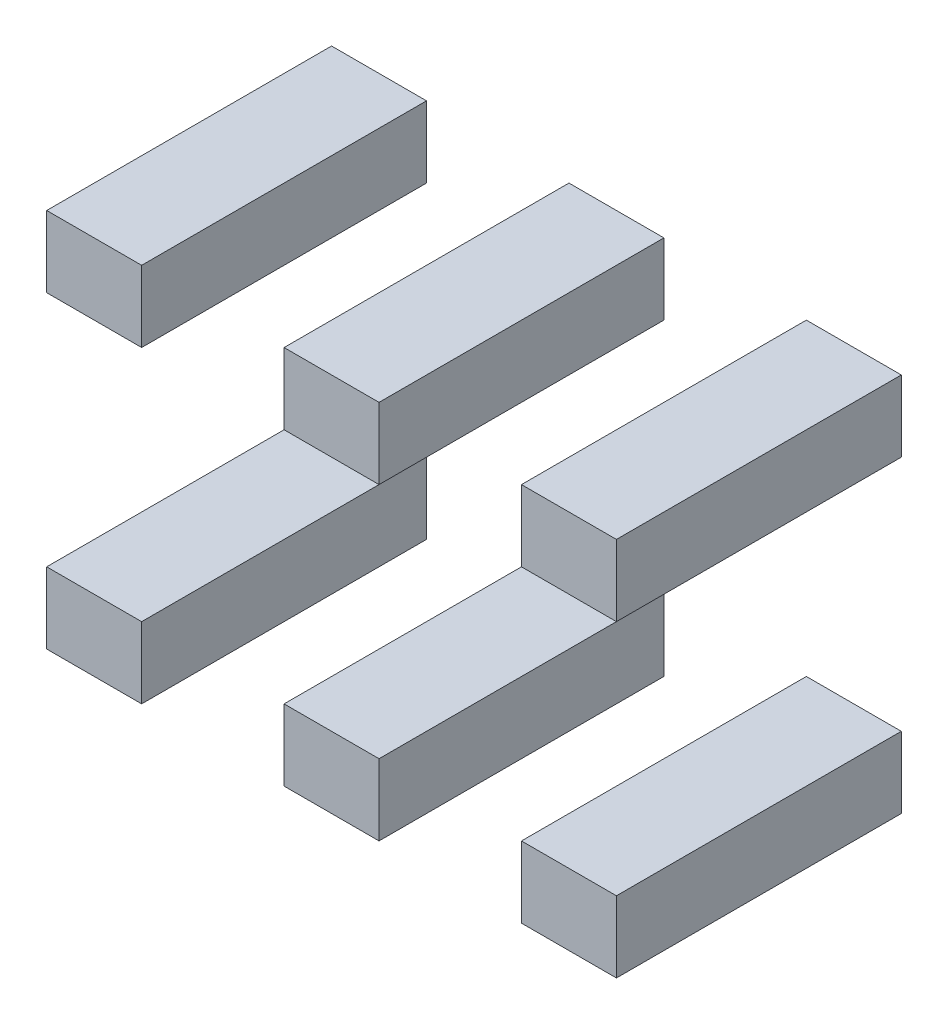
ISO-10303-21;
HEADER;
FILE_DESCRIPTION(('STEP AP214'),'2;1');
FILE_NAME('part.step','',(''),(''),'','','');
FILE_SCHEMA(('AUTOMOTIVE_DESIGN { 1 0 10303 214 1 1 1 1 }'));
ENDSEC;
DATA;
#1=APPLICATION_CONTEXT('core data for automotive mechanical design processes');
#2=APPLICATION_PROTOCOL_DEFINITION('international standard','automotive_design',2000,#1);
#3=PRODUCT_CONTEXT('',#1,'mechanical');
#4=PRODUCT('Part','Part','',(#3));
#5=PRODUCT_RELATED_PRODUCT_CATEGORY('part','',(#4));
#6=PRODUCT_DEFINITION_FORMATION('','',#4);
#7=PRODUCT_DEFINITION_CONTEXT('part definition',#1,'design');
#8=PRODUCT_DEFINITION('design','',#6,#7);
#9=PRODUCT_DEFINITION_SHAPE('','',#8);
#10=(LENGTH_UNIT() NAMED_UNIT(*) SI_UNIT(.MILLI.,.METRE.));
#11=(NAMED_UNIT(*) PLANE_ANGLE_UNIT() SI_UNIT($,.RADIAN.));
#12=(NAMED_UNIT(*) SI_UNIT($,.STERADIAN.) SOLID_ANGLE_UNIT());
#13=UNCERTAINTY_MEASURE_WITH_UNIT(LENGTH_MEASURE(1.E-05),#10,'distance_accuracy_value','');
#14=(GEOMETRIC_REPRESENTATION_CONTEXT(3) GLOBAL_UNCERTAINTY_ASSIGNED_CONTEXT((#13)) GLOBAL_UNIT_ASSIGNED_CONTEXT((#10,
#11,#12)) REPRESENTATION_CONTEXT('',''));
#15=CARTESIAN_POINT('',(0.,0.,0.));
#16=DIRECTION('',(0.,0.,1.));
#17=DIRECTION('',(1.,0.,0.));
#18=AXIS2_PLACEMENT_3D('',#15,#16,#17);
#19=CARTESIAN_POINT('',(0.6,-0.4,0.));
#20=DIRECTION('',(0.,-1.,0.));
#21=DIRECTION('',(0.,0.,-1.));
#22=AXIS2_PLACEMENT_3D('',#19,#20,#21);
#23=PLANE('',#22);
#24=DIRECTION('',(0.,0.,1.));
#25=VECTOR('',#24,1.);
#26=CARTESIAN_POINT('',(0.4,-0.4,0.));
#27=LINE('',#26,#25);
#28=CARTESIAN_POINT('',(0.4,-0.4,0.));
#29=VERTEX_POINT('',#28);
#30=CARTESIAN_POINT('',(0.4,-0.4,0.6));
#31=VERTEX_POINT('',#30);
#32=EDGE_CURVE('P0_E20',#29,#31,#27,.T.);
#33=ORIENTED_EDGE('',*,*,#32,.F.);
#34=DIRECTION('',(1.,0.,0.));
#35=VECTOR('',#34,1.);
#36=CARTESIAN_POINT('',(0.4,-0.4,0.));
#37=LINE('',#36,#35);
#38=CARTESIAN_POINT('',(0.6,-0.4,0.));
#39=VERTEX_POINT('',#38);
#40=EDGE_CURVE('P0_E80',#29,#39,#37,.T.);
#41=ORIENTED_EDGE('',*,*,#40,.T.);
#42=DIRECTION('',(0.,0.,-1.));
#43=VECTOR('',#42,1.);
#44=CARTESIAN_POINT('',(0.6,-0.4,0.));
#45=LINE('',#44,#43);
#46=CARTESIAN_POINT('',(0.6,-0.4,0.6));
#47=VERTEX_POINT('',#46);
#48=EDGE_CURVE('P0_E68',#47,#39,#45,.T.);
#49=ORIENTED_EDGE('',*,*,#48,.F.);
#50=DIRECTION('',(1.,0.,0.));
#51=VECTOR('',#50,1.);
#52=CARTESIAN_POINT('',(0.4,-0.4,0.6));
#53=LINE('',#52,#51);
#54=EDGE_CURVE('P0_E56',#31,#47,#53,.T.);
#55=ORIENTED_EDGE('',*,*,#54,.F.);
#56=EDGE_LOOP('',(#33,#41,#49,#55));
#57=FACE_BOUND('',#56,.T.);
#58=ADVANCED_FACE('P0_F17',(#57),#23,.T.);
#59=CARTESIAN_POINT('',(0.4,-0.4,0.));
#60=DIRECTION('',(-1.,0.,0.));
#61=DIRECTION('',(0.,0.,1.));
#62=AXIS2_PLACEMENT_3D('',#59,#60,#61);
#63=PLANE('',#62);
#64=DIRECTION('',(0.,0.,1.));
#65=VECTOR('',#64,1.);
#66=CARTESIAN_POINT('',(0.4,-0.25,0.));
#67=LINE('',#66,#65);
#68=CARTESIAN_POINT('',(0.4,-0.25,0.));
#69=VERTEX_POINT('',#68);
#70=CARTESIAN_POINT('',(0.4,-0.25,0.6));
#71=VERTEX_POINT('',#70);
#72=EDGE_CURVE('P0_E83',#69,#71,#67,.T.);
#73=ORIENTED_EDGE('',*,*,#72,.F.);
#74=DIRECTION('',(0.,1.,0.));
#75=VECTOR('',#74,1.);
#76=CARTESIAN_POINT('',(0.4,-0.25,0.));
#77=LINE('',#76,#75);
#78=EDGE_CURVE('P0_E65',#69,#29,#77,.F.);
#79=ORIENTED_EDGE('',*,*,#78,.T.);
#80=ORIENTED_EDGE('',*,*,#32,.T.);
#81=DIRECTION('',(0.,1.,0.));
#82=VECTOR('',#81,1.);
#83=CARTESIAN_POINT('',(0.4,-0.25,0.6));
#84=LINE('',#83,#82);
#85=EDGE_CURVE('P0_E62',#71,#31,#84,.F.);
#86=ORIENTED_EDGE('',*,*,#85,.F.);
#87=EDGE_LOOP('',(#73,#79,#80,#86));
#88=FACE_BOUND('',#87,.T.);
#89=ADVANCED_FACE('P0_F61',(#88),#63,.T.);
#90=CARTESIAN_POINT('',(0.4,-0.25,0.6));
#91=DIRECTION('',(0.,0.,1.));
#92=DIRECTION('',(1.,0.,0.));
#93=AXIS2_PLACEMENT_3D('',#90,#91,#92);
#94=PLANE('',#93);
#95=DIRECTION('',(0.,1.,0.));
#96=VECTOR('',#95,1.);
#97=CARTESIAN_POINT('',(0.6,-0.25,0.6));
#98=LINE('',#97,#96);
#99=CARTESIAN_POINT('',(0.6,-0.25,0.6));
#100=VERTEX_POINT('',#99);
#101=EDGE_CURVE('P0_E70',#100,#47,#98,.F.);
#102=ORIENTED_EDGE('',*,*,#101,.F.);
#103=DIRECTION('',(1.,0.,0.));
#104=VECTOR('',#103,1.);
#105=CARTESIAN_POINT('',(0.4,-0.25,0.6));
#106=LINE('',#105,#104);
#107=EDGE_CURVE('P0_E74',#71,#100,#106,.T.);
#108=ORIENTED_EDGE('',*,*,#107,.F.);
#109=ORIENTED_EDGE('',*,*,#85,.T.);
#110=ORIENTED_EDGE('',*,*,#54,.T.);
#111=EDGE_LOOP('',(#102,#108,#109,#110));
#112=FACE_BOUND('',#111,.T.);
#113=ADVANCED_FACE('P0_F72',(#112),#94,.T.);
#114=CARTESIAN_POINT('',(0.6,-0.25,0.));
#115=DIRECTION('',(1.,0.,0.));
#116=DIRECTION('',(0.,0.,-1.));
#117=AXIS2_PLACEMENT_3D('',#114,#115,#116);
#118=PLANE('',#117);
#119=ORIENTED_EDGE('',*,*,#48,.T.);
#120=DIRECTION('',(0.,1.,0.));
#121=VECTOR('',#120,1.);
#122=CARTESIAN_POINT('',(0.6,-0.25,0.));
#123=LINE('',#122,#121);
#124=CARTESIAN_POINT('',(0.6,-0.25,0.));
#125=VERTEX_POINT('',#124);
#126=EDGE_CURVE('P0_E35',#39,#125,#123,.T.);
#127=ORIENTED_EDGE('',*,*,#126,.T.);
#128=DIRECTION('',(0.,0.,1.));
#129=VECTOR('',#128,1.);
#130=CARTESIAN_POINT('',(0.6,-0.25,0.));
#131=LINE('',#130,#129);
#132=EDGE_CURVE('P0_E26',#100,#125,#131,.F.);
#133=ORIENTED_EDGE('',*,*,#132,.F.);
#134=ORIENTED_EDGE('',*,*,#101,.T.);
#135=EDGE_LOOP('',(#119,#127,#133,#134));
#136=FACE_BOUND('',#135,.T.);
#137=ADVANCED_FACE('P0_F89',(#136),#118,.T.);
#138=CARTESIAN_POINT('',(0.4,-0.25,0.));
#139=DIRECTION('',(0.,0.,1.));
#140=DIRECTION('',(1.,0.,0.));
#141=AXIS2_PLACEMENT_3D('',#138,#139,#140);
#142=PLANE('',#141);
#143=ORIENTED_EDGE('',*,*,#126,.F.);
#144=ORIENTED_EDGE('',*,*,#40,.F.);
#145=ORIENTED_EDGE('',*,*,#78,.F.);
#146=DIRECTION('',(1.,0.,0.));
#147=VECTOR('',#146,1.);
#148=CARTESIAN_POINT('',(0.4,-0.25,0.));
#149=LINE('',#148,#147);
#150=EDGE_CURVE('P0_E11',#125,#69,#149,.F.);
#151=ORIENTED_EDGE('',*,*,#150,.F.);
#152=EDGE_LOOP('',(#143,#144,#145,#151));
#153=FACE_BOUND('',#152,.T.);
#154=ADVANCED_FACE('P0_F91',(#153),#142,.F.);
#155=CARTESIAN_POINT('',(0.4,-0.25,0.));
#156=DIRECTION('',(0.,1.,0.));
#157=DIRECTION('',(0.,0.,1.));
#158=AXIS2_PLACEMENT_3D('',#155,#156,#157);
#159=PLANE('',#158);
#160=ORIENTED_EDGE('',*,*,#132,.T.);
#161=ORIENTED_EDGE('',*,*,#150,.T.);
#162=ORIENTED_EDGE('',*,*,#72,.T.);
#163=ORIENTED_EDGE('',*,*,#107,.T.);
#164=EDGE_LOOP('',(#160,#161,#162,#163));
#165=FACE_BOUND('',#164,.T.);
#166=ADVANCED_FACE('P0_F88',(#165),#159,.T.);
#167=CLOSED_SHELL('',(#58,#89,#113,#137,#154,#166));
#168=MANIFOLD_SOLID_BREP('P0_B1',#167);
#169=CARTESIAN_POINT('',(0.1,0.25,0.));
#170=DIRECTION('',(0.,-1.,0.));
#171=DIRECTION('',(0.,0.,-1.));
#172=AXIS2_PLACEMENT_3D('',#169,#170,#171);
#173=PLANE('',#172);
#174=DIRECTION('',(0.,0.,1.));
#175=VECTOR('',#174,1.);
#176=CARTESIAN_POINT('',(-0.1,0.25,0.));
#177=LINE('',#176,#175);
#178=CARTESIAN_POINT('',(-0.1,0.25,0.));
#179=VERTEX_POINT('',#178);
#180=CARTESIAN_POINT('',(-0.1,0.25,0.6));
#181=VERTEX_POINT('',#180);
#182=EDGE_CURVE('P1_E20',#179,#181,#177,.T.);
#183=ORIENTED_EDGE('',*,*,#182,.F.);
#184=DIRECTION('',(1.,0.,0.));
#185=VECTOR('',#184,1.);
#186=CARTESIAN_POINT('',(-0.1,0.25,0.));
#187=LINE('',#186,#185);
#188=CARTESIAN_POINT('',(0.1,0.25,0.));
#189=VERTEX_POINT('',#188);
#190=EDGE_CURVE('P1_E80',#179,#189,#187,.T.);
#191=ORIENTED_EDGE('',*,*,#190,.T.);
#192=DIRECTION('',(0.,0.,-1.));
#193=VECTOR('',#192,1.);
#194=CARTESIAN_POINT('',(0.1,0.25,0.));
#195=LINE('',#194,#193);
#196=CARTESIAN_POINT('',(0.1,0.25,0.6));
#197=VERTEX_POINT('',#196);
#198=EDGE_CURVE('P1_E68',#197,#189,#195,.T.);
#199=ORIENTED_EDGE('',*,*,#198,.F.);
#200=DIRECTION('',(1.,0.,0.));
#201=VECTOR('',#200,1.);
#202=CARTESIAN_POINT('',(-0.1,0.25,0.6));
#203=LINE('',#202,#201);
#204=EDGE_CURVE('P1_E56',#181,#197,#203,.T.);
#205=ORIENTED_EDGE('',*,*,#204,.F.);
#206=EDGE_LOOP('',(#183,#191,#199,#205));
#207=FACE_BOUND('',#206,.T.);
#208=ADVANCED_FACE('P1_F17',(#207),#173,.T.);
#209=CARTESIAN_POINT('',(-0.1,0.25,0.));
#210=DIRECTION('',(-1.,0.,0.));
#211=DIRECTION('',(0.,0.,1.));
#212=AXIS2_PLACEMENT_3D('',#209,#210,#211);
#213=PLANE('',#212);
#214=DIRECTION('',(0.,0.,1.));
#215=VECTOR('',#214,1.);
#216=CARTESIAN_POINT('',(-0.1,0.4,0.));
#217=LINE('',#216,#215);
#218=CARTESIAN_POINT('',(-0.1,0.4,0.));
#219=VERTEX_POINT('',#218);
#220=CARTESIAN_POINT('',(-0.1,0.4,0.6));
#221=VERTEX_POINT('',#220);
#222=EDGE_CURVE('P1_E83',#219,#221,#217,.T.);
#223=ORIENTED_EDGE('',*,*,#222,.F.);
#224=DIRECTION('',(0.,1.,0.));
#225=VECTOR('',#224,1.);
#226=CARTESIAN_POINT('',(-0.1,0.4,0.));
#227=LINE('',#226,#225);
#228=EDGE_CURVE('P1_E65',#219,#179,#227,.F.);
#229=ORIENTED_EDGE('',*,*,#228,.T.);
#230=ORIENTED_EDGE('',*,*,#182,.T.);
#231=DIRECTION('',(0.,1.,0.));
#232=VECTOR('',#231,1.);
#233=CARTESIAN_POINT('',(-0.1,0.4,0.6));
#234=LINE('',#233,#232);
#235=EDGE_CURVE('P1_E62',#221,#181,#234,.F.);
#236=ORIENTED_EDGE('',*,*,#235,.F.);
#237=EDGE_LOOP('',(#223,#229,#230,#236));
#238=FACE_BOUND('',#237,.T.);
#239=ADVANCED_FACE('P1_F61',(#238),#213,.T.);
#240=CARTESIAN_POINT('',(-0.1,0.4,0.6));
#241=DIRECTION('',(0.,0.,1.));
#242=DIRECTION('',(1.,0.,0.));
#243=AXIS2_PLACEMENT_3D('',#240,#241,#242);
#244=PLANE('',#243);
#245=DIRECTION('',(0.,1.,0.));
#246=VECTOR('',#245,1.);
#247=CARTESIAN_POINT('',(0.1,0.4,0.6));
#248=LINE('',#247,#246);
#249=CARTESIAN_POINT('',(0.1,0.4,0.6));
#250=VERTEX_POINT('',#249);
#251=EDGE_CURVE('P1_E70',#250,#197,#248,.F.);
#252=ORIENTED_EDGE('',*,*,#251,.F.);
#253=DIRECTION('',(1.,0.,0.));
#254=VECTOR('',#253,1.);
#255=CARTESIAN_POINT('',(-0.1,0.4,0.6));
#256=LINE('',#255,#254);
#257=EDGE_CURVE('P1_E74',#221,#250,#256,.T.);
#258=ORIENTED_EDGE('',*,*,#257,.F.);
#259=ORIENTED_EDGE('',*,*,#235,.T.);
#260=ORIENTED_EDGE('',*,*,#204,.T.);
#261=EDGE_LOOP('',(#252,#258,#259,#260));
#262=FACE_BOUND('',#261,.T.);
#263=ADVANCED_FACE('P1_F72',(#262),#244,.T.);
#264=CARTESIAN_POINT('',(0.1,0.4,0.));
#265=DIRECTION('',(1.,0.,0.));
#266=DIRECTION('',(0.,0.,-1.));
#267=AXIS2_PLACEMENT_3D('',#264,#265,#266);
#268=PLANE('',#267);
#269=ORIENTED_EDGE('',*,*,#198,.T.);
#270=DIRECTION('',(0.,1.,0.));
#271=VECTOR('',#270,1.);
#272=CARTESIAN_POINT('',(0.1,0.4,0.));
#273=LINE('',#272,#271);
#274=CARTESIAN_POINT('',(0.1,0.4,0.));
#275=VERTEX_POINT('',#274);
#276=EDGE_CURVE('P1_E35',#189,#275,#273,.T.);
#277=ORIENTED_EDGE('',*,*,#276,.T.);
#278=DIRECTION('',(0.,0.,1.));
#279=VECTOR('',#278,1.);
#280=CARTESIAN_POINT('',(0.1,0.4,0.));
#281=LINE('',#280,#279);
#282=EDGE_CURVE('P1_E26',#250,#275,#281,.F.);
#283=ORIENTED_EDGE('',*,*,#282,.F.);
#284=ORIENTED_EDGE('',*,*,#251,.T.);
#285=EDGE_LOOP('',(#269,#277,#283,#284));
#286=FACE_BOUND('',#285,.T.);
#287=ADVANCED_FACE('P1_F89',(#286),#268,.T.);
#288=CARTESIAN_POINT('',(-0.1,0.4,0.));
#289=DIRECTION('',(0.,0.,1.));
#290=DIRECTION('',(1.,0.,0.));
#291=AXIS2_PLACEMENT_3D('',#288,#289,#290);
#292=PLANE('',#291);
#293=ORIENTED_EDGE('',*,*,#276,.F.);
#294=ORIENTED_EDGE('',*,*,#190,.F.);
#295=ORIENTED_EDGE('',*,*,#228,.F.);
#296=DIRECTION('',(1.,0.,0.));
#297=VECTOR('',#296,1.);
#298=CARTESIAN_POINT('',(-0.1,0.4,0.));
#299=LINE('',#298,#297);
#300=EDGE_CURVE('P1_E11',#275,#219,#299,.F.);
#301=ORIENTED_EDGE('',*,*,#300,.F.);
#302=EDGE_LOOP('',(#293,#294,#295,#301));
#303=FACE_BOUND('',#302,.T.);
#304=ADVANCED_FACE('P1_F91',(#303),#292,.F.);
#305=CARTESIAN_POINT('',(-0.1,0.4,0.));
#306=DIRECTION('',(0.,1.,0.));
#307=DIRECTION('',(0.,0.,1.));
#308=AXIS2_PLACEMENT_3D('',#305,#306,#307);
#309=PLANE('',#308);
#310=ORIENTED_EDGE('',*,*,#282,.T.);
#311=ORIENTED_EDGE('',*,*,#300,.T.);
#312=ORIENTED_EDGE('',*,*,#222,.T.);
#313=ORIENTED_EDGE('',*,*,#257,.T.);
#314=EDGE_LOOP('',(#310,#311,#312,#313));
#315=FACE_BOUND('',#314,.T.);
#316=ADVANCED_FACE('P1_F88',(#315),#309,.T.);
#317=CLOSED_SHELL('',(#208,#239,#263,#287,#304,#316));
#318=MANIFOLD_SOLID_BREP('P1_B1',#317);
#319=CARTESIAN_POINT('',(-0.4,-0.4,0.));
#320=DIRECTION('',(0.,-1.,0.));
#321=DIRECTION('',(0.,0.,-1.));
#322=AXIS2_PLACEMENT_3D('',#319,#320,#321);
#323=PLANE('',#322);
#324=DIRECTION('',(0.,0.,1.));
#325=VECTOR('',#324,1.);
#326=CARTESIAN_POINT('',(-0.6,-0.4,0.));
#327=LINE('',#326,#325);
#328=CARTESIAN_POINT('',(-0.6,-0.4,0.));
#329=VERTEX_POINT('',#328);
#330=CARTESIAN_POINT('',(-0.6,-0.4,0.6));
#331=VERTEX_POINT('',#330);
#332=EDGE_CURVE('P2_E20',#329,#331,#327,.T.);
#333=ORIENTED_EDGE('',*,*,#332,.F.);
#334=DIRECTION('',(1.,0.,0.));
#335=VECTOR('',#334,1.);
#336=CARTESIAN_POINT('',(-0.6,-0.4,0.));
#337=LINE('',#336,#335);
#338=CARTESIAN_POINT('',(-0.4,-0.4,0.));
#339=VERTEX_POINT('',#338);
#340=EDGE_CURVE('P2_E80',#329,#339,#337,.T.);
#341=ORIENTED_EDGE('',*,*,#340,.T.);
#342=DIRECTION('',(0.,0.,-1.));
#343=VECTOR('',#342,1.);
#344=CARTESIAN_POINT('',(-0.4,-0.4,0.));
#345=LINE('',#344,#343);
#346=CARTESIAN_POINT('',(-0.4,-0.4,0.6));
#347=VERTEX_POINT('',#346);
#348=EDGE_CURVE('P2_E68',#347,#339,#345,.T.);
#349=ORIENTED_EDGE('',*,*,#348,.F.);
#350=DIRECTION('',(1.,0.,0.));
#351=VECTOR('',#350,1.);
#352=CARTESIAN_POINT('',(-0.6,-0.4,0.6));
#353=LINE('',#352,#351);
#354=EDGE_CURVE('P2_E56',#331,#347,#353,.T.);
#355=ORIENTED_EDGE('',*,*,#354,.F.);
#356=EDGE_LOOP('',(#333,#341,#349,#355));
#357=FACE_BOUND('',#356,.T.);
#358=ADVANCED_FACE('P2_F17',(#357),#323,.T.);
#359=CARTESIAN_POINT('',(-0.6,-0.4,0.));
#360=DIRECTION('',(-1.,0.,0.));
#361=DIRECTION('',(0.,0.,1.));
#362=AXIS2_PLACEMENT_3D('',#359,#360,#361);
#363=PLANE('',#362);
#364=DIRECTION('',(0.,0.,1.));
#365=VECTOR('',#364,1.);
#366=CARTESIAN_POINT('',(-0.6,-0.25,0.));
#367=LINE('',#366,#365);
#368=CARTESIAN_POINT('',(-0.6,-0.25,0.));
#369=VERTEX_POINT('',#368);
#370=CARTESIAN_POINT('',(-0.6,-0.25,0.6));
#371=VERTEX_POINT('',#370);
#372=EDGE_CURVE('P2_E83',#369,#371,#367,.T.);
#373=ORIENTED_EDGE('',*,*,#372,.F.);
#374=DIRECTION('',(0.,1.,0.));
#375=VECTOR('',#374,1.);
#376=CARTESIAN_POINT('',(-0.6,-0.25,0.));
#377=LINE('',#376,#375);
#378=EDGE_CURVE('P2_E65',#369,#329,#377,.F.);
#379=ORIENTED_EDGE('',*,*,#378,.T.);
#380=ORIENTED_EDGE('',*,*,#332,.T.);
#381=DIRECTION('',(0.,1.,0.));
#382=VECTOR('',#381,1.);
#383=CARTESIAN_POINT('',(-0.6,-0.25,0.6));
#384=LINE('',#383,#382);
#385=EDGE_CURVE('P2_E62',#371,#331,#384,.F.);
#386=ORIENTED_EDGE('',*,*,#385,.F.);
#387=EDGE_LOOP('',(#373,#379,#380,#386));
#388=FACE_BOUND('',#387,.T.);
#389=ADVANCED_FACE('P2_F61',(#388),#363,.T.);
#390=CARTESIAN_POINT('',(-0.6,-0.25,0.6));
#391=DIRECTION('',(0.,0.,1.));
#392=DIRECTION('',(1.,0.,0.));
#393=AXIS2_PLACEMENT_3D('',#390,#391,#392);
#394=PLANE('',#393);
#395=DIRECTION('',(0.,1.,0.));
#396=VECTOR('',#395,1.);
#397=CARTESIAN_POINT('',(-0.4,-0.25,0.6));
#398=LINE('',#397,#396);
#399=CARTESIAN_POINT('',(-0.4,-0.25,0.6));
#400=VERTEX_POINT('',#399);
#401=EDGE_CURVE('P2_E70',#400,#347,#398,.F.);
#402=ORIENTED_EDGE('',*,*,#401,.F.);
#403=DIRECTION('',(1.,0.,0.));
#404=VECTOR('',#403,1.);
#405=CARTESIAN_POINT('',(-0.6,-0.25,0.6));
#406=LINE('',#405,#404);
#407=EDGE_CURVE('P2_E74',#371,#400,#406,.T.);
#408=ORIENTED_EDGE('',*,*,#407,.F.);
#409=ORIENTED_EDGE('',*,*,#385,.T.);
#410=ORIENTED_EDGE('',*,*,#354,.T.);
#411=EDGE_LOOP('',(#402,#408,#409,#410));
#412=FACE_BOUND('',#411,.T.);
#413=ADVANCED_FACE('P2_F72',(#412),#394,.T.);
#414=CARTESIAN_POINT('',(-0.4,-0.25,0.));
#415=DIRECTION('',(1.,0.,0.));
#416=DIRECTION('',(0.,0.,-1.));
#417=AXIS2_PLACEMENT_3D('',#414,#415,#416);
#418=PLANE('',#417);
#419=ORIENTED_EDGE('',*,*,#348,.T.);
#420=DIRECTION('',(0.,1.,0.));
#421=VECTOR('',#420,1.);
#422=CARTESIAN_POINT('',(-0.4,-0.25,0.));
#423=LINE('',#422,#421);
#424=CARTESIAN_POINT('',(-0.4,-0.25,0.));
#425=VERTEX_POINT('',#424);
#426=EDGE_CURVE('P2_E35',#339,#425,#423,.T.);
#427=ORIENTED_EDGE('',*,*,#426,.T.);
#428=DIRECTION('',(0.,0.,1.));
#429=VECTOR('',#428,1.);
#430=CARTESIAN_POINT('',(-0.4,-0.25,0.));
#431=LINE('',#430,#429);
#432=EDGE_CURVE('P2_E26',#400,#425,#431,.F.);
#433=ORIENTED_EDGE('',*,*,#432,.F.);
#434=ORIENTED_EDGE('',*,*,#401,.T.);
#435=EDGE_LOOP('',(#419,#427,#433,#434));
#436=FACE_BOUND('',#435,.T.);
#437=ADVANCED_FACE('P2_F89',(#436),#418,.T.);
#438=CARTESIAN_POINT('',(-0.6,-0.25,0.));
#439=DIRECTION('',(0.,0.,1.));
#440=DIRECTION('',(1.,0.,0.));
#441=AXIS2_PLACEMENT_3D('',#438,#439,#440);
#442=PLANE('',#441);
#443=ORIENTED_EDGE('',*,*,#426,.F.);
#444=ORIENTED_EDGE('',*,*,#340,.F.);
#445=ORIENTED_EDGE('',*,*,#378,.F.);
#446=DIRECTION('',(1.,0.,0.));
#447=VECTOR('',#446,1.);
#448=CARTESIAN_POINT('',(-0.6,-0.25,0.));
#449=LINE('',#448,#447);
#450=EDGE_CURVE('P2_E11',#425,#369,#449,.F.);
#451=ORIENTED_EDGE('',*,*,#450,.F.);
#452=EDGE_LOOP('',(#443,#444,#445,#451));
#453=FACE_BOUND('',#452,.T.);
#454=ADVANCED_FACE('P2_F91',(#453),#442,.F.);
#455=CARTESIAN_POINT('',(-0.6,-0.25,0.));
#456=DIRECTION('',(0.,1.,0.));
#457=DIRECTION('',(0.,0.,1.));
#458=AXIS2_PLACEMENT_3D('',#455,#456,#457);
#459=PLANE('',#458);
#460=ORIENTED_EDGE('',*,*,#432,.T.);
#461=ORIENTED_EDGE('',*,*,#450,.T.);
#462=ORIENTED_EDGE('',*,*,#372,.T.);
#463=ORIENTED_EDGE('',*,*,#407,.T.);
#464=EDGE_LOOP('',(#460,#461,#462,#463));
#465=FACE_BOUND('',#464,.T.);
#466=ADVANCED_FACE('P2_F88',(#465),#459,.T.);
#467=CLOSED_SHELL('',(#358,#389,#413,#437,#454,#466));
#468=MANIFOLD_SOLID_BREP('P2_B1',#467);
#469=CARTESIAN_POINT('',(0.100000000048,-0.250000000003,0.));
#470=DIRECTION('',(0.,-1.,0.));
#471=DIRECTION('',(0.,0.,-1.));
#472=AXIS2_PLACEMENT_3D('',#469,#470,#471);
#473=PLANE('',#472);
#474=DIRECTION('',(0.,0.,-1.));
#475=VECTOR('',#474,1.);
#476=CARTESIAN_POINT('',(-0.09999999995203,-0.250000000003,0.));
#477=LINE('',#476,#475);
#478=CARTESIAN_POINT('',(-0.09999999995203,-0.250000000003,0.));
#479=VERTEX_POINT('',#478);
#480=CARTESIAN_POINT('',(-0.09999999995203,-0.250000000003,0.6));
#481=VERTEX_POINT('',#480);
#482=EDGE_CURVE('P3_E20',#479,#481,#477,.F.);
#483=ORIENTED_EDGE('',*,*,#482,.T.);
#484=DIRECTION('',(-1.,0.,0.));
#485=VECTOR('',#484,1.);
#486=CARTESIAN_POINT('',(-0.09999999995203,-0.250000000003,0.6));
#487=LINE('',#486,#485);
#488=CARTESIAN_POINT('',(0.100000000048,-0.250000000003,0.6));
#489=VERTEX_POINT('',#488);
#490=EDGE_CURVE('P3_E55',#481,#489,#487,.F.);
#491=ORIENTED_EDGE('',*,*,#490,.T.);
#492=DIRECTION('',(0.,0.,1.));
#493=VECTOR('',#492,1.);
#494=CARTESIAN_POINT('',(0.100000000048,-0.250000000003,0.));
#495=LINE('',#494,#493);
#496=CARTESIAN_POINT('',(0.100000000048,-0.250000000003,0.));
#497=VERTEX_POINT('',#496);
#498=EDGE_CURVE('P3_E76',#489,#497,#495,.F.);
#499=ORIENTED_EDGE('',*,*,#498,.T.);
#500=DIRECTION('',(-1.,0.,0.));
#501=VECTOR('',#500,1.);
#502=CARTESIAN_POINT('',(-0.09999999995203,-0.250000000003,0.));
#503=LINE('',#502,#501);
#504=EDGE_CURVE('P3_E58',#479,#497,#503,.F.);
#505=ORIENTED_EDGE('',*,*,#504,.F.);
#506=EDGE_LOOP('',(#483,#491,#499,#505));
#507=FACE_BOUND('',#506,.T.);
#508=ADVANCED_FACE('P3_F17',(#507),#473,.F.);
#509=CARTESIAN_POINT('',(-0.09999999995203,-0.250000000003,0.));
#510=DIRECTION('',(1.,0.,0.));
#511=DIRECTION('',(0.,0.,-1.));
#512=AXIS2_PLACEMENT_3D('',#509,#510,#511);
#513=PLANE('',#512);
#514=DIRECTION('',(0.,0.,1.));
#515=VECTOR('',#514,1.);
#516=CARTESIAN_POINT('',(-0.09999999995203,-0.400000000003,0.));
#517=LINE('',#516,#515);
#518=CARTESIAN_POINT('',(-0.09999999995203,-0.400000000003,0.));
#519=VERTEX_POINT('',#518);
#520=CARTESIAN_POINT('',(-0.09999999995203,-0.400000000003,0.6));
#521=VERTEX_POINT('',#520);
#522=EDGE_CURVE('P3_E73',#519,#521,#517,.T.);
#523=ORIENTED_EDGE('',*,*,#522,.T.);
#524=DIRECTION('',(0.,1.,0.));
#525=VECTOR('',#524,1.);
#526=CARTESIAN_POINT('',(-0.09999999995203,-0.400000000003,0.6));
#527=LINE('',#526,#525);
#528=EDGE_CURVE('P3_E63',#521,#481,#527,.T.);
#529=ORIENTED_EDGE('',*,*,#528,.T.);
#530=ORIENTED_EDGE('',*,*,#482,.F.);
#531=DIRECTION('',(0.,1.,0.));
#532=VECTOR('',#531,1.);
#533=CARTESIAN_POINT('',(-0.09999999995203,-0.400000000003,0.));
#534=LINE('',#533,#532);
#535=EDGE_CURVE('P3_E78',#519,#479,#534,.T.);
#536=ORIENTED_EDGE('',*,*,#535,.F.);
#537=EDGE_LOOP('',(#523,#529,#530,#536));
#538=FACE_BOUND('',#537,.T.);
#539=ADVANCED_FACE('P3_F72',(#538),#513,.F.);
#540=CARTESIAN_POINT('',(-0.09999999995203,-0.400000000003,0.6));
#541=DIRECTION('',(0.,0.,-1.));
#542=DIRECTION('',(-1.,0.,0.));
#543=AXIS2_PLACEMENT_3D('',#540,#541,#542);
#544=PLANE('',#543);
#545=DIRECTION('',(0.,1.,0.));
#546=VECTOR('',#545,1.);
#547=CARTESIAN_POINT('',(0.100000000048,-0.400000000003,0.6));
#548=LINE('',#547,#546);
#549=CARTESIAN_POINT('',(0.100000000048,-0.400000000003,0.6));
#550=VERTEX_POINT('',#549);
#551=EDGE_CURVE('P3_E69',#550,#489,#548,.T.);
#552=ORIENTED_EDGE('',*,*,#551,.T.);
#553=ORIENTED_EDGE('',*,*,#490,.F.);
#554=ORIENTED_EDGE('',*,*,#528,.F.);
#555=DIRECTION('',(1.,0.,0.));
#556=VECTOR('',#555,1.);
#557=CARTESIAN_POINT('',(-0.09999999995203,-0.400000000003,0.6));
#558=LINE('',#557,#556);
#559=EDGE_CURVE('P3_E83',#521,#550,#558,.T.);
#560=ORIENTED_EDGE('',*,*,#559,.T.);
#561=EDGE_LOOP('',(#552,#553,#554,#560));
#562=FACE_BOUND('',#561,.T.);
#563=ADVANCED_FACE('P3_F66',(#562),#544,.F.);
#564=CARTESIAN_POINT('',(0.100000000048,-0.400000000003,0.));
#565=DIRECTION('',(-1.,0.,0.));
#566=DIRECTION('',(0.,0.,1.));
#567=AXIS2_PLACEMENT_3D('',#564,#565,#566);
#568=PLANE('',#567);
#569=ORIENTED_EDGE('',*,*,#498,.F.);
#570=ORIENTED_EDGE('',*,*,#551,.F.);
#571=DIRECTION('',(0.,0.,1.));
#572=VECTOR('',#571,1.);
#573=CARTESIAN_POINT('',(0.100000000048,-0.400000000003,0.));
#574=LINE('',#573,#572);
#575=CARTESIAN_POINT('',(0.100000000048,-0.400000000003,0.));
#576=VERTEX_POINT('',#575);
#577=EDGE_CURVE('P3_E26',#550,#576,#574,.F.);
#578=ORIENTED_EDGE('',*,*,#577,.T.);
#579=DIRECTION('',(0.,1.,0.));
#580=VECTOR('',#579,1.);
#581=CARTESIAN_POINT('',(0.100000000048,-0.400000000003,0.));
#582=LINE('',#581,#580);
#583=EDGE_CURVE('P3_E34',#497,#576,#582,.F.);
#584=ORIENTED_EDGE('',*,*,#583,.F.);
#585=EDGE_LOOP('',(#569,#570,#578,#584));
#586=FACE_BOUND('',#585,.T.);
#587=ADVANCED_FACE('P3_F88',(#586),#568,.F.);
#588=CARTESIAN_POINT('',(-0.09999999995203,-0.400000000003,0.));
#589=DIRECTION('',(0.,0.,-1.));
#590=DIRECTION('',(-1.,0.,0.));
#591=AXIS2_PLACEMENT_3D('',#588,#589,#590);
#592=PLANE('',#591);
#593=ORIENTED_EDGE('',*,*,#583,.T.);
#594=DIRECTION('',(1.,0.,0.));
#595=VECTOR('',#594,1.);
#596=CARTESIAN_POINT('',(-0.09999999995203,-0.400000000003,0.));
#597=LINE('',#596,#595);
#598=EDGE_CURVE('P3_E11',#576,#519,#597,.F.);
#599=ORIENTED_EDGE('',*,*,#598,.T.);
#600=ORIENTED_EDGE('',*,*,#535,.T.);
#601=ORIENTED_EDGE('',*,*,#504,.T.);
#602=EDGE_LOOP('',(#593,#599,#600,#601));
#603=FACE_BOUND('',#602,.T.);
#604=ADVANCED_FACE('P3_F91',(#603),#592,.T.);
#605=CARTESIAN_POINT('',(-0.09999999995203,-0.400000000003,0.));
#606=DIRECTION('',(0.,1.,0.));
#607=DIRECTION('',(0.,0.,1.));
#608=AXIS2_PLACEMENT_3D('',#605,#606,#607);
#609=PLANE('',#608);
#610=ORIENTED_EDGE('',*,*,#577,.F.);
#611=ORIENTED_EDGE('',*,*,#559,.F.);
#612=ORIENTED_EDGE('',*,*,#522,.F.);
#613=ORIENTED_EDGE('',*,*,#598,.F.);
#614=EDGE_LOOP('',(#610,#611,#612,#613));
#615=FACE_BOUND('',#614,.T.);
#616=ADVANCED_FACE('P3_F90',(#615),#609,.F.);
#617=CLOSED_SHELL('',(#508,#539,#563,#587,#604,#616));
#618=MANIFOLD_SOLID_BREP('P3_B1',#617);
#619=CARTESIAN_POINT('',(0.6,0.25,0.));
#620=DIRECTION('',(0.,-1.,0.));
#621=DIRECTION('',(0.,0.,-1.));
#622=AXIS2_PLACEMENT_3D('',#619,#620,#621);
#623=PLANE('',#622);
#624=DIRECTION('',(0.,0.,1.));
#625=VECTOR('',#624,1.);
#626=CARTESIAN_POINT('',(0.4,0.25,0.));
#627=LINE('',#626,#625);
#628=CARTESIAN_POINT('',(0.4,0.25,0.));
#629=VERTEX_POINT('',#628);
#630=CARTESIAN_POINT('',(0.4,0.25,0.6));
#631=VERTEX_POINT('',#630);
#632=EDGE_CURVE('P4_E20',#629,#631,#627,.T.);
#633=ORIENTED_EDGE('',*,*,#632,.F.);
#634=DIRECTION('',(1.,0.,0.));
#635=VECTOR('',#634,1.);
#636=CARTESIAN_POINT('',(0.4,0.25,0.));
#637=LINE('',#636,#635);
#638=CARTESIAN_POINT('',(0.6,0.25,0.));
#639=VERTEX_POINT('',#638);
#640=EDGE_CURVE('P4_E80',#629,#639,#637,.T.);
#641=ORIENTED_EDGE('',*,*,#640,.T.);
#642=DIRECTION('',(0.,0.,-1.));
#643=VECTOR('',#642,1.);
#644=CARTESIAN_POINT('',(0.6,0.25,0.));
#645=LINE('',#644,#643);
#646=CARTESIAN_POINT('',(0.6,0.25,0.6));
#647=VERTEX_POINT('',#646);
#648=EDGE_CURVE('P4_E68',#647,#639,#645,.T.);
#649=ORIENTED_EDGE('',*,*,#648,.F.);
#650=DIRECTION('',(1.,0.,0.));
#651=VECTOR('',#650,1.);
#652=CARTESIAN_POINT('',(0.4,0.25,0.6));
#653=LINE('',#652,#651);
#654=EDGE_CURVE('P4_E56',#631,#647,#653,.T.);
#655=ORIENTED_EDGE('',*,*,#654,.F.);
#656=EDGE_LOOP('',(#633,#641,#649,#655));
#657=FACE_BOUND('',#656,.T.);
#658=ADVANCED_FACE('P4_F17',(#657),#623,.T.);
#659=CARTESIAN_POINT('',(0.4,0.25,0.));
#660=DIRECTION('',(-1.,0.,0.));
#661=DIRECTION('',(0.,0.,1.));
#662=AXIS2_PLACEMENT_3D('',#659,#660,#661);
#663=PLANE('',#662);
#664=DIRECTION('',(0.,0.,1.));
#665=VECTOR('',#664,1.);
#666=CARTESIAN_POINT('',(0.4,0.4,0.));
#667=LINE('',#666,#665);
#668=CARTESIAN_POINT('',(0.4,0.4,0.));
#669=VERTEX_POINT('',#668);
#670=CARTESIAN_POINT('',(0.4,0.4,0.6));
#671=VERTEX_POINT('',#670);
#672=EDGE_CURVE('P4_E83',#669,#671,#667,.T.);
#673=ORIENTED_EDGE('',*,*,#672,.F.);
#674=DIRECTION('',(0.,1.,0.));
#675=VECTOR('',#674,1.);
#676=CARTESIAN_POINT('',(0.4,0.4,0.));
#677=LINE('',#676,#675);
#678=EDGE_CURVE('P4_E65',#669,#629,#677,.F.);
#679=ORIENTED_EDGE('',*,*,#678,.T.);
#680=ORIENTED_EDGE('',*,*,#632,.T.);
#681=DIRECTION('',(0.,1.,0.));
#682=VECTOR('',#681,1.);
#683=CARTESIAN_POINT('',(0.4,0.4,0.6));
#684=LINE('',#683,#682);
#685=EDGE_CURVE('P4_E62',#671,#631,#684,.F.);
#686=ORIENTED_EDGE('',*,*,#685,.F.);
#687=EDGE_LOOP('',(#673,#679,#680,#686));
#688=FACE_BOUND('',#687,.T.);
#689=ADVANCED_FACE('P4_F61',(#688),#663,.T.);
#690=CARTESIAN_POINT('',(0.4,0.4,0.6));
#691=DIRECTION('',(0.,0.,1.));
#692=DIRECTION('',(1.,0.,0.));
#693=AXIS2_PLACEMENT_3D('',#690,#691,#692);
#694=PLANE('',#693);
#695=DIRECTION('',(0.,1.,0.));
#696=VECTOR('',#695,1.);
#697=CARTESIAN_POINT('',(0.6,0.4,0.6));
#698=LINE('',#697,#696);
#699=CARTESIAN_POINT('',(0.6,0.4,0.6));
#700=VERTEX_POINT('',#699);
#701=EDGE_CURVE('P4_E70',#700,#647,#698,.F.);
#702=ORIENTED_EDGE('',*,*,#701,.F.);
#703=DIRECTION('',(1.,0.,0.));
#704=VECTOR('',#703,1.);
#705=CARTESIAN_POINT('',(0.4,0.4,0.6));
#706=LINE('',#705,#704);
#707=EDGE_CURVE('P4_E74',#671,#700,#706,.T.);
#708=ORIENTED_EDGE('',*,*,#707,.F.);
#709=ORIENTED_EDGE('',*,*,#685,.T.);
#710=ORIENTED_EDGE('',*,*,#654,.T.);
#711=EDGE_LOOP('',(#702,#708,#709,#710));
#712=FACE_BOUND('',#711,.T.);
#713=ADVANCED_FACE('P4_F72',(#712),#694,.T.);
#714=CARTESIAN_POINT('',(0.6,0.4,0.));
#715=DIRECTION('',(1.,0.,0.));
#716=DIRECTION('',(0.,0.,-1.));
#717=AXIS2_PLACEMENT_3D('',#714,#715,#716);
#718=PLANE('',#717);
#719=ORIENTED_EDGE('',*,*,#648,.T.);
#720=DIRECTION('',(0.,1.,0.));
#721=VECTOR('',#720,1.);
#722=CARTESIAN_POINT('',(0.6,0.4,0.));
#723=LINE('',#722,#721);
#724=CARTESIAN_POINT('',(0.6,0.4,0.));
#725=VERTEX_POINT('',#724);
#726=EDGE_CURVE('P4_E35',#639,#725,#723,.T.);
#727=ORIENTED_EDGE('',*,*,#726,.T.);
#728=DIRECTION('',(0.,0.,1.));
#729=VECTOR('',#728,1.);
#730=CARTESIAN_POINT('',(0.6,0.4,0.));
#731=LINE('',#730,#729);
#732=EDGE_CURVE('P4_E26',#700,#725,#731,.F.);
#733=ORIENTED_EDGE('',*,*,#732,.F.);
#734=ORIENTED_EDGE('',*,*,#701,.T.);
#735=EDGE_LOOP('',(#719,#727,#733,#734));
#736=FACE_BOUND('',#735,.T.);
#737=ADVANCED_FACE('P4_F89',(#736),#718,.T.);
#738=CARTESIAN_POINT('',(0.4,0.4,0.));
#739=DIRECTION('',(0.,0.,1.));
#740=DIRECTION('',(1.,0.,0.));
#741=AXIS2_PLACEMENT_3D('',#738,#739,#740);
#742=PLANE('',#741);
#743=ORIENTED_EDGE('',*,*,#726,.F.);
#744=ORIENTED_EDGE('',*,*,#640,.F.);
#745=ORIENTED_EDGE('',*,*,#678,.F.);
#746=DIRECTION('',(1.,0.,0.));
#747=VECTOR('',#746,1.);
#748=CARTESIAN_POINT('',(0.4,0.4,0.));
#749=LINE('',#748,#747);
#750=EDGE_CURVE('P4_E11',#725,#669,#749,.F.);
#751=ORIENTED_EDGE('',*,*,#750,.F.);
#752=EDGE_LOOP('',(#743,#744,#745,#751));
#753=FACE_BOUND('',#752,.T.);
#754=ADVANCED_FACE('P4_F91',(#753),#742,.F.);
#755=CARTESIAN_POINT('',(0.4,0.4,0.));
#756=DIRECTION('',(0.,1.,0.));
#757=DIRECTION('',(0.,0.,1.));
#758=AXIS2_PLACEMENT_3D('',#755,#756,#757);
#759=PLANE('',#758);
#760=ORIENTED_EDGE('',*,*,#732,.T.);
#761=ORIENTED_EDGE('',*,*,#750,.T.);
#762=ORIENTED_EDGE('',*,*,#672,.T.);
#763=ORIENTED_EDGE('',*,*,#707,.T.);
#764=EDGE_LOOP('',(#760,#761,#762,#763));
#765=FACE_BOUND('',#764,.T.);
#766=ADVANCED_FACE('P4_F88',(#765),#759,.T.);
#767=CLOSED_SHELL('',(#658,#689,#713,#737,#754,#766));
#768=MANIFOLD_SOLID_BREP('P4_B1',#767);
#769=CARTESIAN_POINT('',(-0.4,0.25,0.));
#770=DIRECTION('',(0.,-1.,0.));
#771=DIRECTION('',(0.,0.,-1.));
#772=AXIS2_PLACEMENT_3D('',#769,#770,#771);
#773=PLANE('',#772);
#774=DIRECTION('',(0.,0.,1.));
#775=VECTOR('',#774,1.);
#776=CARTESIAN_POINT('',(-0.6,0.25,0.));
#777=LINE('',#776,#775);
#778=CARTESIAN_POINT('',(-0.6,0.25,0.));
#779=VERTEX_POINT('',#778);
#780=CARTESIAN_POINT('',(-0.6,0.25,0.6));
#781=VERTEX_POINT('',#780);
#782=EDGE_CURVE('P5_E19',#779,#781,#777,.T.);
#783=ORIENTED_EDGE('',*,*,#782,.F.);
#784=DIRECTION('',(1.,0.,0.));
#785=VECTOR('',#784,1.);
#786=CARTESIAN_POINT('',(-0.6,0.25,0.));
#787=LINE('',#786,#785);
#788=CARTESIAN_POINT('',(-0.4,0.25,0.));
#789=VERTEX_POINT('',#788);
#790=EDGE_CURVE('P5_E79',#779,#789,#787,.T.);
#791=ORIENTED_EDGE('',*,*,#790,.T.);
#792=DIRECTION('',(0.,0.,-1.));
#793=VECTOR('',#792,1.);
#794=CARTESIAN_POINT('',(-0.4,0.25,0.));
#795=LINE('',#794,#793);
#796=CARTESIAN_POINT('',(-0.4,0.25,0.6));
#797=VERTEX_POINT('',#796);
#798=EDGE_CURVE('P5_E67',#797,#789,#795,.T.);
#799=ORIENTED_EDGE('',*,*,#798,.F.);
#800=DIRECTION('',(1.,0.,0.));
#801=VECTOR('',#800,1.);
#802=CARTESIAN_POINT('',(-0.6,0.25,0.6));
#803=LINE('',#802,#801);
#804=EDGE_CURVE('P5_E55',#781,#797,#803,.T.);
#805=ORIENTED_EDGE('',*,*,#804,.F.);
#806=EDGE_LOOP('',(#783,#791,#799,#805));
#807=FACE_BOUND('',#806,.T.);
#808=ADVANCED_FACE('P5_F16',(#807),#773,.T.);
#809=CARTESIAN_POINT('',(-0.6,0.25,0.));
#810=DIRECTION('',(-1.,0.,0.));
#811=DIRECTION('',(0.,0.,1.));
#812=AXIS2_PLACEMENT_3D('',#809,#810,#811);
#813=PLANE('',#812);
#814=DIRECTION('',(0.,0.,1.));
#815=VECTOR('',#814,1.);
#816=CARTESIAN_POINT('',(-0.6,0.4,0.));
#817=LINE('',#816,#815);
#818=CARTESIAN_POINT('',(-0.6,0.4,0.));
#819=VERTEX_POINT('',#818);
#820=CARTESIAN_POINT('',(-0.6,0.4,0.6));
#821=VERTEX_POINT('',#820);
#822=EDGE_CURVE('P5_E82',#819,#821,#817,.T.);
#823=ORIENTED_EDGE('',*,*,#822,.F.);
#824=DIRECTION('',(0.,1.,0.));
#825=VECTOR('',#824,1.);
#826=CARTESIAN_POINT('',(-0.6,0.4,0.));
#827=LINE('',#826,#825);
#828=EDGE_CURVE('P5_E64',#819,#779,#827,.F.);
#829=ORIENTED_EDGE('',*,*,#828,.T.);
#830=ORIENTED_EDGE('',*,*,#782,.T.);
#831=DIRECTION('',(0.,1.,0.));
#832=VECTOR('',#831,1.);
#833=CARTESIAN_POINT('',(-0.6,0.4,0.6));
#834=LINE('',#833,#832);
#835=EDGE_CURVE('P5_E61',#821,#781,#834,.F.);
#836=ORIENTED_EDGE('',*,*,#835,.F.);
#837=EDGE_LOOP('',(#823,#829,#830,#836));
#838=FACE_BOUND('',#837,.T.);
#839=ADVANCED_FACE('P5_F60',(#838),#813,.T.);
#840=CARTESIAN_POINT('',(-0.6,0.4,0.6));
#841=DIRECTION('',(0.,0.,1.));
#842=DIRECTION('',(1.,0.,0.));
#843=AXIS2_PLACEMENT_3D('',#840,#841,#842);
#844=PLANE('',#843);
#845=DIRECTION('',(0.,1.,0.));
#846=VECTOR('',#845,1.);
#847=CARTESIAN_POINT('',(-0.4,0.4,0.6));
#848=LINE('',#847,#846);
#849=CARTESIAN_POINT('',(-0.4,0.4,0.6));
#850=VERTEX_POINT('',#849);
#851=EDGE_CURVE('P5_E69',#850,#797,#848,.F.);
#852=ORIENTED_EDGE('',*,*,#851,.F.);
#853=DIRECTION('',(1.,0.,0.));
#854=VECTOR('',#853,1.);
#855=CARTESIAN_POINT('',(-0.6,0.4,0.6));
#856=LINE('',#855,#854);
#857=EDGE_CURVE('P5_E73',#821,#850,#856,.T.);
#858=ORIENTED_EDGE('',*,*,#857,.F.);
#859=ORIENTED_EDGE('',*,*,#835,.T.);
#860=ORIENTED_EDGE('',*,*,#804,.T.);
#861=EDGE_LOOP('',(#852,#858,#859,#860));
#862=FACE_BOUND('',#861,.T.);
#863=ADVANCED_FACE('P5_F71',(#862),#844,.T.);
#864=CARTESIAN_POINT('',(-0.4,0.4,0.));
#865=DIRECTION('',(1.,0.,0.));
#866=DIRECTION('',(0.,0.,-1.));
#867=AXIS2_PLACEMENT_3D('',#864,#865,#866);
#868=PLANE('',#867);
#869=ORIENTED_EDGE('',*,*,#798,.T.);
#870=DIRECTION('',(0.,1.,0.));
#871=VECTOR('',#870,1.);
#872=CARTESIAN_POINT('',(-0.4,0.4,0.));
#873=LINE('',#872,#871);
#874=CARTESIAN_POINT('',(-0.4,0.4,0.));
#875=VERTEX_POINT('',#874);
#876=EDGE_CURVE('P5_E34',#789,#875,#873,.T.);
#877=ORIENTED_EDGE('',*,*,#876,.T.);
#878=DIRECTION('',(0.,0.,1.));
#879=VECTOR('',#878,1.);
#880=CARTESIAN_POINT('',(-0.4,0.4,0.));
#881=LINE('',#880,#879);
#882=EDGE_CURVE('P5_E25',#850,#875,#881,.F.);
#883=ORIENTED_EDGE('',*,*,#882,.F.);
#884=ORIENTED_EDGE('',*,*,#851,.T.);
#885=EDGE_LOOP('',(#869,#877,#883,#884));
#886=FACE_BOUND('',#885,.T.);
#887=ADVANCED_FACE('P5_F88',(#886),#868,.T.);
#888=CARTESIAN_POINT('',(-0.6,0.4,0.));
#889=DIRECTION('',(0.,0.,1.));
#890=DIRECTION('',(1.,0.,0.));
#891=AXIS2_PLACEMENT_3D('',#888,#889,#890);
#892=PLANE('',#891);
#893=ORIENTED_EDGE('',*,*,#876,.F.);
#894=ORIENTED_EDGE('',*,*,#790,.F.);
#895=ORIENTED_EDGE('',*,*,#828,.F.);
#896=DIRECTION('',(1.,0.,0.));
#897=VECTOR('',#896,1.);
#898=CARTESIAN_POINT('',(-0.6,0.4,0.));
#899=LINE('',#898,#897);
#900=EDGE_CURVE('P5_E10',#875,#819,#899,.F.);
#901=ORIENTED_EDGE('',*,*,#900,.F.);
#902=EDGE_LOOP('',(#893,#894,#895,#901));
#903=FACE_BOUND('',#902,.T.);
#904=ADVANCED_FACE('P5_F90',(#903),#892,.F.);
#905=CARTESIAN_POINT('',(-0.6,0.4,0.));
#906=DIRECTION('',(0.,1.,0.));
#907=DIRECTION('',(0.,0.,1.));
#908=AXIS2_PLACEMENT_3D('',#905,#906,#907);
#909=PLANE('',#908);
#910=ORIENTED_EDGE('',*,*,#882,.T.);
#911=ORIENTED_EDGE('',*,*,#900,.T.);
#912=ORIENTED_EDGE('',*,*,#822,.T.);
#913=ORIENTED_EDGE('',*,*,#857,.T.);
#914=EDGE_LOOP('',(#910,#911,#912,#913));
#915=FACE_BOUND('',#914,.T.);
#916=ADVANCED_FACE('P5_F87',(#915),#909,.T.);
#917=CLOSED_SHELL('',(#808,#839,#863,#887,#904,#916));
#918=MANIFOLD_SOLID_BREP('P5_B1',#917);
#919=ADVANCED_BREP_SHAPE_REPRESENTATION('',(#18,#168,#318,#468,#618,#768,#918),#14);
#920=SHAPE_DEFINITION_REPRESENTATION(#9,#919);
ENDSEC;
END-ISO-10303-21;
